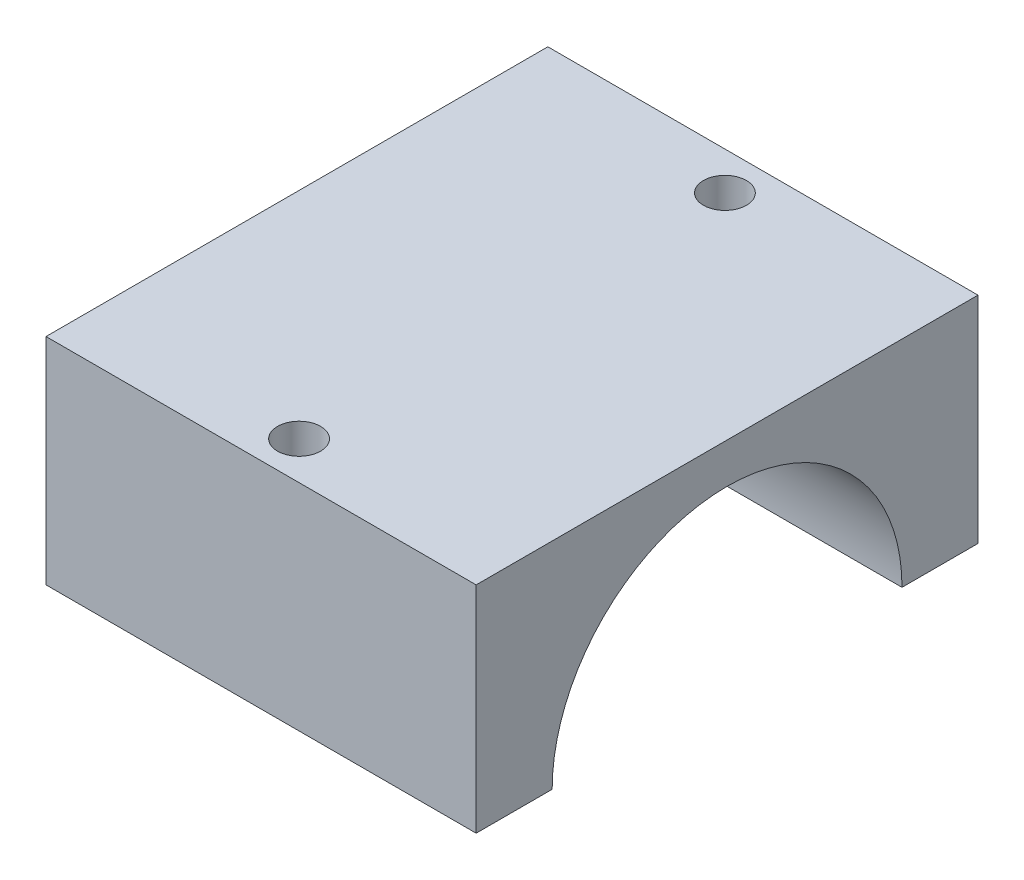
ISO-10303-21;
HEADER;
FILE_DESCRIPTION(('STEP AP214'),'2;1');
FILE_NAME('part.step','',(''),(''),'','','');
FILE_SCHEMA(('AUTOMOTIVE_DESIGN { 1 0 10303 214 1 1 1 1 }'));
ENDSEC;
DATA;
#1=APPLICATION_CONTEXT('core data for automotive mechanical design processes');
#2=APPLICATION_PROTOCOL_DEFINITION('international standard','automotive_design',2000,#1);
#3=PRODUCT_CONTEXT('',#1,'mechanical');
#4=PRODUCT('Part','Part','',(#3));
#5=PRODUCT_RELATED_PRODUCT_CATEGORY('part','',(#4));
#6=PRODUCT_DEFINITION_FORMATION('','',#4);
#7=PRODUCT_DEFINITION_CONTEXT('part definition',#1,'design');
#8=PRODUCT_DEFINITION('design','',#6,#7);
#9=PRODUCT_DEFINITION_SHAPE('','',#8);
#10=(LENGTH_UNIT() NAMED_UNIT(*) SI_UNIT(.MILLI.,.METRE.));
#11=(NAMED_UNIT(*) PLANE_ANGLE_UNIT() SI_UNIT($,.RADIAN.));
#12=(NAMED_UNIT(*) SI_UNIT($,.STERADIAN.) SOLID_ANGLE_UNIT());
#13=UNCERTAINTY_MEASURE_WITH_UNIT(LENGTH_MEASURE(1.E-05),#10,'distance_accuracy_value','');
#14=(GEOMETRIC_REPRESENTATION_CONTEXT(3) GLOBAL_UNCERTAINTY_ASSIGNED_CONTEXT((#13)) GLOBAL_UNIT_ASSIGNED_CONTEXT((#10,
#11,#12)) REPRESENTATION_CONTEXT('',''));
#15=CARTESIAN_POINT('',(0.,0.,0.));
#16=DIRECTION('',(0.,0.,1.));
#17=DIRECTION('',(1.,0.,0.));
#18=AXIS2_PLACEMENT_3D('',#15,#16,#17);
#19=CARTESIAN_POINT('',(30.,0.,12.2));
#20=DIRECTION('',(0.,1.,0.));
#21=DIRECTION('',(0.,0.,1.));
#22=AXIS2_PLACEMENT_3D('',#19,#20,#21);
#23=PLANE('',#22);
#24=CARTESIAN_POINT('',(15.,0.,14.85));
#25=DIRECTION('',(0.,1.,0.));
#26=DIRECTION('',(0.,0.,1.));
#27=AXIS2_PLACEMENT_3D('',#24,#25,#26);
#28=CIRCLE('',#27,1.5);
#29=CARTESIAN_POINT('',(15.,0.,16.35));
#30=VERTEX_POINT('',#29);
#31=EDGE_CURVE('E121',#30,#30,#28,.T.);
#32=ORIENTED_EDGE('',*,*,#31,.T.);
#33=EDGE_LOOP('',(#32));
#34=FACE_BOUND('',#33,.T.);
#35=DIRECTION('',(0.,0.,-1.));
#36=VECTOR('',#35,1.);
#37=CARTESIAN_POINT('',(0.,0.,12.2));
#38=LINE('',#37,#36);
#39=CARTESIAN_POINT('',(0.,0.,17.5));
#40=VERTEX_POINT('',#39);
#41=CARTESIAN_POINT('',(0.,0.,12.2));
#42=VERTEX_POINT('',#41);
#43=EDGE_CURVE('E117',#40,#42,#38,.T.);
#44=ORIENTED_EDGE('',*,*,#43,.T.);
#45=DIRECTION('',(-1.,0.,0.));
#46=VECTOR('',#45,1.);
#47=CARTESIAN_POINT('',(30.,0.,12.2));
#48=LINE('',#47,#46);
#49=CARTESIAN_POINT('',(30.,0.,12.2));
#50=VERTEX_POINT('',#49);
#51=EDGE_CURVE('E11',#50,#42,#48,.T.);
#52=ORIENTED_EDGE('',*,*,#51,.F.);
#53=DIRECTION('',(0.,0.,-1.));
#54=VECTOR('',#53,1.);
#55=CARTESIAN_POINT('',(30.,0.,12.2));
#56=LINE('',#55,#54);
#57=CARTESIAN_POINT('',(30.,0.,17.5));
#58=VERTEX_POINT('',#57);
#59=EDGE_CURVE('E128',#58,#50,#56,.T.);
#60=ORIENTED_EDGE('',*,*,#59,.F.);
#61=DIRECTION('',(-1.,0.,0.));
#62=VECTOR('',#61,1.);
#63=CARTESIAN_POINT('',(30.,0.,17.5));
#64=LINE('',#63,#62);
#65=EDGE_CURVE('E113',#58,#40,#64,.T.);
#66=ORIENTED_EDGE('',*,*,#65,.T.);
#67=EDGE_LOOP('',(#44,#52,#60,#66));
#68=FACE_BOUND('',#67,.T.);
#69=ADVANCED_FACE('F33',(#34,#68),#23,.F.);
#70=CARTESIAN_POINT('',(30.,0.,0.));
#71=DIRECTION('',(-1.,0.,0.));
#72=DIRECTION('',(0.,0.,1.));
#73=AXIS2_PLACEMENT_3D('',#70,#71,#72);
#74=CYLINDRICAL_SURFACE('',#73,12.2);
#75=CARTESIAN_POINT('',(0.,0.,0.));
#76=DIRECTION('',(-1.,0.,0.));
#77=DIRECTION('',(0.,0.,-1.));
#78=AXIS2_PLACEMENT_3D('',#75,#76,#77);
#79=CIRCLE('',#78,12.2);
#80=CARTESIAN_POINT('',(0.,0.,-12.2));
#81=VERTEX_POINT('',#80);
#82=EDGE_CURVE('E120',#42,#81,#79,.T.);
#83=ORIENTED_EDGE('',*,*,#82,.T.);
#84=DIRECTION('',(-1.,0.,0.));
#85=VECTOR('',#84,1.);
#86=CARTESIAN_POINT('',(30.,0.,-12.2));
#87=LINE('',#86,#85);
#88=CARTESIAN_POINT('',(30.,0.,-12.2));
#89=VERTEX_POINT('',#88);
#90=EDGE_CURVE('E41',#89,#81,#87,.T.);
#91=ORIENTED_EDGE('',*,*,#90,.F.);
#92=CARTESIAN_POINT('',(30.,0.,0.));
#93=DIRECTION('',(-1.,0.,0.));
#94=DIRECTION('',(0.,0.,-1.));
#95=AXIS2_PLACEMENT_3D('',#92,#93,#94);
#96=CIRCLE('',#95,12.2);
#97=EDGE_CURVE('E86',#50,#89,#96,.T.);
#98=ORIENTED_EDGE('',*,*,#97,.F.);
#99=ORIENTED_EDGE('',*,*,#51,.T.);
#100=EDGE_LOOP('',(#83,#91,#98,#99));
#101=FACE_BOUND('',#100,.T.);
#102=ADVANCED_FACE('F153',(#101),#74,.F.);
#103=CARTESIAN_POINT('',(30.,0.,-17.5));
#104=DIRECTION('',(0.,1.,0.));
#105=DIRECTION('',(0.,0.,1.));
#106=AXIS2_PLACEMENT_3D('',#103,#104,#105);
#107=PLANE('',#106);
#108=CARTESIAN_POINT('',(15.,0.,-14.85));
#109=DIRECTION('',(0.,1.,0.));
#110=DIRECTION('',(0.,0.,1.));
#111=AXIS2_PLACEMENT_3D('',#108,#109,#110);
#112=CIRCLE('',#111,1.5);
#113=CARTESIAN_POINT('',(15.,0.,-13.35));
#114=VERTEX_POINT('',#113);
#115=EDGE_CURVE('E164',#114,#114,#112,.T.);
#116=ORIENTED_EDGE('',*,*,#115,.T.);
#117=EDGE_LOOP('',(#116));
#118=FACE_BOUND('',#117,.T.);
#119=DIRECTION('',(0.,0.,-1.));
#120=VECTOR('',#119,1.);
#121=CARTESIAN_POINT('',(0.,0.,-17.5));
#122=LINE('',#121,#120);
#123=CARTESIAN_POINT('',(0.,0.,-17.5));
#124=VERTEX_POINT('',#123);
#125=EDGE_CURVE('E123',#81,#124,#122,.T.);
#126=ORIENTED_EDGE('',*,*,#125,.T.);
#127=DIRECTION('',(-1.,0.,0.));
#128=VECTOR('',#127,1.);
#129=CARTESIAN_POINT('',(30.,0.,-17.5));
#130=LINE('',#129,#128);
#131=CARTESIAN_POINT('',(30.,0.,-17.5));
#132=VERTEX_POINT('',#131);
#133=EDGE_CURVE('E108',#132,#124,#130,.T.);
#134=ORIENTED_EDGE('',*,*,#133,.F.);
#135=DIRECTION('',(0.,0.,-1.));
#136=VECTOR('',#135,1.);
#137=CARTESIAN_POINT('',(30.,0.,-17.5));
#138=LINE('',#137,#136);
#139=EDGE_CURVE('E99',#89,#132,#138,.T.);
#140=ORIENTED_EDGE('',*,*,#139,.F.);
#141=ORIENTED_EDGE('',*,*,#90,.T.);
#142=EDGE_LOOP('',(#126,#134,#140,#141));
#143=FACE_BOUND('',#142,.T.);
#144=ADVANCED_FACE('F134',(#118,#143),#107,.F.);
#145=CARTESIAN_POINT('',(30.,15.,-17.5));
#146=DIRECTION('',(0.,0.,1.));
#147=DIRECTION('',(0.,-1.,0.));
#148=AXIS2_PLACEMENT_3D('',#145,#146,#147);
#149=PLANE('',#148);
#150=DIRECTION('',(0.,1.,0.));
#151=VECTOR('',#150,1.);
#152=CARTESIAN_POINT('',(0.,15.,-17.5));
#153=LINE('',#152,#151);
#154=CARTESIAN_POINT('',(0.,15.,-17.5));
#155=VERTEX_POINT('',#154);
#156=EDGE_CURVE('E107',#124,#155,#153,.T.);
#157=ORIENTED_EDGE('',*,*,#156,.T.);
#158=DIRECTION('',(-1.,0.,0.));
#159=VECTOR('',#158,1.);
#160=CARTESIAN_POINT('',(30.,15.,-17.5));
#161=LINE('',#160,#159);
#162=CARTESIAN_POINT('',(30.,15.,-17.5));
#163=VERTEX_POINT('',#162);
#164=EDGE_CURVE('E104',#163,#155,#161,.T.);
#165=ORIENTED_EDGE('',*,*,#164,.F.);
#166=DIRECTION('',(0.,1.,0.));
#167=VECTOR('',#166,1.);
#168=CARTESIAN_POINT('',(30.,15.,-17.5));
#169=LINE('',#168,#167);
#170=EDGE_CURVE('E93',#132,#163,#169,.T.);
#171=ORIENTED_EDGE('',*,*,#170,.F.);
#172=ORIENTED_EDGE('',*,*,#133,.T.);
#173=EDGE_LOOP('',(#157,#165,#171,#172));
#174=FACE_BOUND('',#173,.T.);
#175=ADVANCED_FACE('F105',(#174),#149,.F.);
#176=CARTESIAN_POINT('',(30.,15.,17.5));
#177=DIRECTION('',(0.,-1.,0.));
#178=DIRECTION('',(0.,0.,-1.));
#179=AXIS2_PLACEMENT_3D('',#176,#177,#178);
#180=PLANE('',#179);
#181=CARTESIAN_POINT('',(15.,15.,-14.85));
#182=DIRECTION('',(0.,1.,0.));
#183=DIRECTION('',(0.,0.,1.));
#184=AXIS2_PLACEMENT_3D('',#181,#182,#183);
#185=CIRCLE('',#184,1.49999999999999);
#186=CARTESIAN_POINT('',(15.,15.,-13.35));
#187=VERTEX_POINT('',#186);
#188=EDGE_CURVE('E171',#187,#187,#185,.T.);
#189=ORIENTED_EDGE('',*,*,#188,.F.);
#190=EDGE_LOOP('',(#189));
#191=FACE_BOUND('',#190,.T.);
#192=CARTESIAN_POINT('',(15.,15.,14.85));
#193=DIRECTION('',(0.,1.,0.));
#194=DIRECTION('',(0.,0.,1.));
#195=AXIS2_PLACEMENT_3D('',#192,#193,#194);
#196=CIRCLE('',#195,1.49999999999999);
#197=CARTESIAN_POINT('',(15.,15.,16.35));
#198=VERTEX_POINT('',#197);
#199=EDGE_CURVE('E161',#198,#198,#196,.T.);
#200=ORIENTED_EDGE('',*,*,#199,.F.);
#201=EDGE_LOOP('',(#200));
#202=FACE_BOUND('',#201,.T.);
#203=DIRECTION('',(0.,0.,1.));
#204=VECTOR('',#203,1.);
#205=CARTESIAN_POINT('',(0.,15.,17.5));
#206=LINE('',#205,#204);
#207=CARTESIAN_POINT('',(0.,15.,17.5));
#208=VERTEX_POINT('',#207);
#209=EDGE_CURVE('E72',#155,#208,#206,.T.);
#210=ORIENTED_EDGE('',*,*,#209,.T.);
#211=DIRECTION('',(-1.,0.,0.));
#212=VECTOR('',#211,1.);
#213=CARTESIAN_POINT('',(30.,15.,17.5));
#214=LINE('',#213,#212);
#215=CARTESIAN_POINT('',(30.,15.,17.5));
#216=VERTEX_POINT('',#215);
#217=EDGE_CURVE('E109',#216,#208,#214,.T.);
#218=ORIENTED_EDGE('',*,*,#217,.F.);
#219=DIRECTION('',(0.,0.,1.));
#220=VECTOR('',#219,1.);
#221=CARTESIAN_POINT('',(30.,15.,17.5));
#222=LINE('',#221,#220);
#223=EDGE_CURVE('E97',#163,#216,#222,.T.);
#224=ORIENTED_EDGE('',*,*,#223,.F.);
#225=ORIENTED_EDGE('',*,*,#164,.T.);
#226=EDGE_LOOP('',(#210,#218,#224,#225));
#227=FACE_BOUND('',#226,.T.);
#228=ADVANCED_FACE('F111',(#191,#202,#227),#180,.F.);
#229=CARTESIAN_POINT('',(30.,0.,17.5));
#230=DIRECTION('',(0.,0.,-1.));
#231=DIRECTION('',(0.,1.,0.));
#232=AXIS2_PLACEMENT_3D('',#229,#230,#231);
#233=PLANE('',#232);
#234=DIRECTION('',(0.,-1.,0.));
#235=VECTOR('',#234,1.);
#236=CARTESIAN_POINT('',(0.,0.,17.5));
#237=LINE('',#236,#235);
#238=EDGE_CURVE('E78',#208,#40,#237,.T.);
#239=ORIENTED_EDGE('',*,*,#238,.T.);
#240=ORIENTED_EDGE('',*,*,#65,.F.);
#241=DIRECTION('',(0.,-1.,0.));
#242=VECTOR('',#241,1.);
#243=CARTESIAN_POINT('',(30.,0.,17.5));
#244=LINE('',#243,#242);
#245=EDGE_CURVE('E49',#216,#58,#244,.T.);
#246=ORIENTED_EDGE('',*,*,#245,.F.);
#247=ORIENTED_EDGE('',*,*,#217,.T.);
#248=EDGE_LOOP('',(#239,#240,#246,#247));
#249=FACE_BOUND('',#248,.T.);
#250=ADVANCED_FACE('F141',(#249),#233,.F.);
#251=CARTESIAN_POINT('',(30.,0.,0.));
#252=DIRECTION('',(1.,0.,0.));
#253=DIRECTION('',(0.,0.,-1.));
#254=AXIS2_PLACEMENT_3D('',#251,#252,#253);
#255=PLANE('',#254);
#256=ORIENTED_EDGE('',*,*,#59,.T.);
#257=ORIENTED_EDGE('',*,*,#97,.T.);
#258=ORIENTED_EDGE('',*,*,#139,.T.);
#259=ORIENTED_EDGE('',*,*,#170,.T.);
#260=ORIENTED_EDGE('',*,*,#223,.T.);
#261=ORIENTED_EDGE('',*,*,#245,.T.);
#262=EDGE_LOOP('',(#256,#257,#258,#259,#260,#261));
#263=FACE_BOUND('',#262,.T.);
#264=ADVANCED_FACE('F95',(#263),#255,.T.);
#265=CARTESIAN_POINT('',(0.,0.,0.));
#266=DIRECTION('',(1.,0.,0.));
#267=DIRECTION('',(0.,0.,-1.));
#268=AXIS2_PLACEMENT_3D('',#265,#266,#267);
#269=PLANE('',#268);
#270=ORIENTED_EDGE('',*,*,#43,.F.);
#271=ORIENTED_EDGE('',*,*,#238,.F.);
#272=ORIENTED_EDGE('',*,*,#209,.F.);
#273=ORIENTED_EDGE('',*,*,#156,.F.);
#274=ORIENTED_EDGE('',*,*,#125,.F.);
#275=ORIENTED_EDGE('',*,*,#82,.F.);
#276=EDGE_LOOP('',(#270,#271,#272,#273,#274,#275));
#277=FACE_BOUND('',#276,.T.);
#278=ADVANCED_FACE('F137',(#277),#269,.F.);
#279=CARTESIAN_POINT('',(15.,15.,14.85));
#280=DIRECTION('',(0.,1.,0.));
#281=DIRECTION('',(0.,0.,1.));
#282=AXIS2_PLACEMENT_3D('',#279,#280,#281);
#283=CYLINDRICAL_SURFACE('',#282,1.49999999999999);
#284=ORIENTED_EDGE('',*,*,#31,.F.);
#285=EDGE_LOOP('',(#284));
#286=FACE_BOUND('',#285,.T.);
#287=ORIENTED_EDGE('',*,*,#199,.T.);
#288=EDGE_LOOP('',(#287));
#289=FACE_BOUND('',#288,.T.);
#290=ADVANCED_FACE('F179',(#286,#289),#283,.F.);
#291=CARTESIAN_POINT('',(15.,15.,-14.85));
#292=DIRECTION('',(0.,1.,0.));
#293=DIRECTION('',(0.,0.,1.));
#294=AXIS2_PLACEMENT_3D('',#291,#292,#293);
#295=CYLINDRICAL_SURFACE('',#294,1.49999999999999);
#296=ORIENTED_EDGE('',*,*,#115,.F.);
#297=EDGE_LOOP('',(#296));
#298=FACE_BOUND('',#297,.T.);
#299=ORIENTED_EDGE('',*,*,#188,.T.);
#300=EDGE_LOOP('',(#299));
#301=FACE_BOUND('',#300,.T.);
#302=ADVANCED_FACE('F175',(#298,#301),#295,.F.);
#303=CLOSED_SHELL('',(#69,#102,#144,#175,#228,#250,#264,#278,#290,#302));
#304=MANIFOLD_SOLID_BREP('B2',#303);
#305=ADVANCED_BREP_SHAPE_REPRESENTATION('',(#18,#304),#14);
#306=SHAPE_DEFINITION_REPRESENTATION(#9,#305);
ENDSEC;
END-ISO-10303-21;
